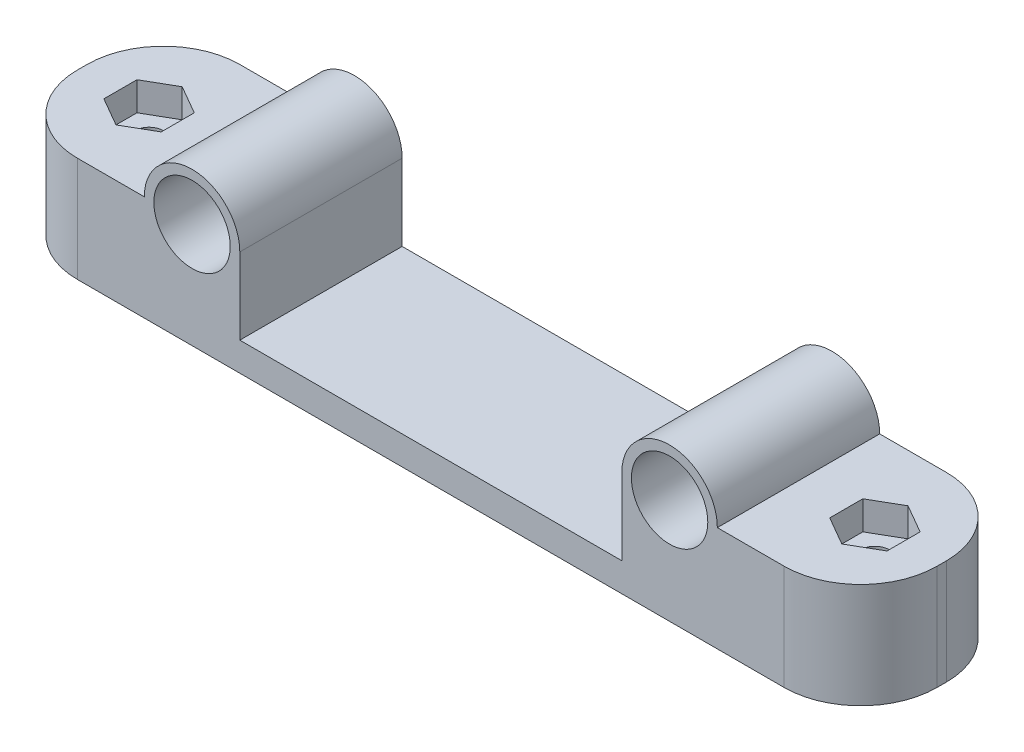
ISO-10303-21;
HEADER;
FILE_DESCRIPTION(('STEP AP214'),'2;1');
FILE_NAME('part.step','',(''),(''),'','','');
FILE_SCHEMA(('AUTOMOTIVE_DESIGN { 1 0 10303 214 1 1 1 1 }'));
ENDSEC;
DATA;
#1=APPLICATION_CONTEXT('core data for automotive mechanical design processes');
#2=APPLICATION_PROTOCOL_DEFINITION('international standard','automotive_design',2000,#1);
#3=PRODUCT_CONTEXT('',#1,'mechanical');
#4=PRODUCT('Part','Part','',(#3));
#5=PRODUCT_RELATED_PRODUCT_CATEGORY('part','',(#4));
#6=PRODUCT_DEFINITION_FORMATION('','',#4);
#7=PRODUCT_DEFINITION_CONTEXT('part definition',#1,'design');
#8=PRODUCT_DEFINITION('design','',#6,#7);
#9=PRODUCT_DEFINITION_SHAPE('','',#8);
#10=(LENGTH_UNIT() NAMED_UNIT(*) SI_UNIT(.MILLI.,.METRE.));
#11=(NAMED_UNIT(*) PLANE_ANGLE_UNIT() SI_UNIT($,.RADIAN.));
#12=(NAMED_UNIT(*) SI_UNIT($,.STERADIAN.) SOLID_ANGLE_UNIT());
#13=UNCERTAINTY_MEASURE_WITH_UNIT(LENGTH_MEASURE(1.E-05),#10,'distance_accuracy_value','');
#14=(GEOMETRIC_REPRESENTATION_CONTEXT(3) GLOBAL_UNCERTAINTY_ASSIGNED_CONTEXT((#13)) GLOBAL_UNIT_ASSIGNED_CONTEXT((#10,
#11,#12)) REPRESENTATION_CONTEXT('',''));
#15=CARTESIAN_POINT('',(0.,0.,0.));
#16=DIRECTION('',(0.,0.,1.));
#17=DIRECTION('',(1.,0.,0.));
#18=AXIS2_PLACEMENT_3D('',#15,#16,#17);
#19=CARTESIAN_POINT('',(-30.,11.,15.));
#20=DIRECTION('',(0.,-1.,0.));
#21=DIRECTION('',(1.,0.,0.));
#22=AXIS2_PLACEMENT_3D('',#19,#20,#21);
#23=PLANE('',#22);
#24=DIRECTION('',(0.,0.,-1.));
#25=VECTOR('',#24,1.);
#26=CARTESIAN_POINT('',(-45.,11.,15.));
#27=LINE('',#26,#25);
#28=CARTESIAN_POINT('',(-45.,11.,7.));
#29=VERTEX_POINT('',#28);
#30=CARTESIAN_POINT('',(-45.,11.,6.));
#31=VERTEX_POINT('',#30);
#32=EDGE_CURVE('E374',#29,#31,#27,.T.);
#33=ORIENTED_EDGE('',*,*,#32,.F.);
#34=CARTESIAN_POINT('',(-37.,11.,7.));
#35=DIRECTION('',(0.,-1.,0.));
#36=DIRECTION('',(1.,0.,0.));
#37=AXIS2_PLACEMENT_3D('',#34,#35,#36);
#38=CIRCLE('',#37,8.);
#39=CARTESIAN_POINT('',(-37.,11.,15.));
#40=VERTEX_POINT('',#39);
#41=EDGE_CURVE('E413',#29,#40,#38,.F.);
#42=ORIENTED_EDGE('',*,*,#41,.T.);
#43=DIRECTION('',(-1.,0.,0.));
#44=VECTOR('',#43,1.);
#45=CARTESIAN_POINT('',(-30.,11.,15.));
#46=LINE('',#45,#44);
#47=CARTESIAN_POINT('',(-30.,11.,15.));
#48=VERTEX_POINT('',#47);
#49=EDGE_CURVE('E362',#48,#40,#46,.T.);
#50=ORIENTED_EDGE('',*,*,#49,.F.);
#51=DIRECTION('',(0.,0.,-1.));
#52=VECTOR('',#51,1.);
#53=CARTESIAN_POINT('',(-30.,11.,15.));
#54=LINE('',#53,#52);
#55=CARTESIAN_POINT('',(-30.,11.,-2.));
#56=VERTEX_POINT('',#55);
#57=EDGE_CURVE('E377',#48,#56,#54,.T.);
#58=ORIENTED_EDGE('',*,*,#57,.T.);
#59=DIRECTION('',(1.,0.,0.));
#60=VECTOR('',#59,1.);
#61=CARTESIAN_POINT('',(-45.,11.,-2.));
#62=LINE('',#61,#60);
#63=CARTESIAN_POINT('',(-37.,11.,-2.));
#64=VERTEX_POINT('',#63);
#65=EDGE_CURVE('E321',#64,#56,#62,.T.);
#66=ORIENTED_EDGE('',*,*,#65,.F.);
#67=CARTESIAN_POINT('',(-37.,11.,6.));
#68=DIRECTION('',(0.,-1.,0.));
#69=DIRECTION('',(1.,0.,0.));
#70=AXIS2_PLACEMENT_3D('',#67,#68,#69);
#71=CIRCLE('',#70,8.);
#72=EDGE_CURVE('E411',#64,#31,#71,.F.);
#73=ORIENTED_EDGE('',*,*,#72,.T.);
#74=EDGE_LOOP('',(#33,#42,#50,#58,#66,#73));
#75=FACE_BOUND('',#74,.T.);
#76=DIRECTION('',(0.866025403784439,0.,-0.5));
#77=VECTOR('',#76,1.);
#78=CARTESIAN_POINT('',(-41.,11.,4.76794919243112));
#79=LINE('',#78,#77);
#80=CARTESIAN_POINT('',(-41.,11.,4.76794919243112));
#81=VERTEX_POINT('',#80);
#82=CARTESIAN_POINT('',(-38.,11.,3.03589838486224));
#83=VERTEX_POINT('',#82);
#84=EDGE_CURVE('E52',#81,#83,#79,.T.);
#85=ORIENTED_EDGE('',*,*,#84,.T.);
#86=DIRECTION('',(0.866025403784439,0.,0.5));
#87=VECTOR('',#86,1.);
#88=CARTESIAN_POINT('',(-38.,11.,3.03589838486224));
#89=LINE('',#88,#87);
#90=CARTESIAN_POINT('',(-35.,11.,4.76794919243112));
#91=VERTEX_POINT('',#90);
#92=EDGE_CURVE('E230',#83,#91,#89,.T.);
#93=ORIENTED_EDGE('',*,*,#92,.T.);
#94=DIRECTION('',(0.,0.,1.));
#95=VECTOR('',#94,1.);
#96=CARTESIAN_POINT('',(-35.,11.,4.76794919243112));
#97=LINE('',#96,#95);
#98=CARTESIAN_POINT('',(-35.,11.,8.23205080756887));
#99=VERTEX_POINT('',#98);
#100=EDGE_CURVE('E233',#91,#99,#97,.T.);
#101=ORIENTED_EDGE('',*,*,#100,.T.);
#102=DIRECTION('',(-0.866025403784438,0.,0.5));
#103=VECTOR('',#102,1.);
#104=CARTESIAN_POINT('',(-35.,11.,8.23205080756887));
#105=LINE('',#104,#103);
#106=CARTESIAN_POINT('',(-38.,11.,9.96410161513775));
#107=VERTEX_POINT('',#106);
#108=EDGE_CURVE('E248',#99,#107,#105,.T.);
#109=ORIENTED_EDGE('',*,*,#108,.T.);
#110=DIRECTION('',(-0.866025403784439,0.,-0.499999999999999));
#111=VECTOR('',#110,1.);
#112=CARTESIAN_POINT('',(-38.,11.,9.96410161513775));
#113=LINE('',#112,#111);
#114=CARTESIAN_POINT('',(-41.,11.,8.23205080756888));
#115=VERTEX_POINT('',#114);
#116=EDGE_CURVE('E245',#107,#115,#113,.T.);
#117=ORIENTED_EDGE('',*,*,#116,.T.);
#118=DIRECTION('',(0.,0.,-1.));
#119=VECTOR('',#118,1.);
#120=CARTESIAN_POINT('',(-41.,11.,8.23205080756888));
#121=LINE('',#120,#119);
#122=EDGE_CURVE('E243',#115,#81,#121,.T.);
#123=ORIENTED_EDGE('',*,*,#122,.T.);
#124=EDGE_LOOP('',(#85,#93,#101,#109,#117,#123));
#125=FACE_BOUND('',#124,.T.);
#126=ADVANCED_FACE('F35',(#75,#125),#23,.F.);
#127=CARTESIAN_POINT('',(-38.,0.,6.5));
#128=DIRECTION('',(0.,1.,0.));
#129=DIRECTION('',(0.,0.,1.));
#130=AXIS2_PLACEMENT_3D('',#127,#128,#129);
#131=CYLINDRICAL_SURFACE('',#130,1.5);
#132=CARTESIAN_POINT('',(-38.,0.,6.5));
#133=DIRECTION('',(0.,-1.,0.));
#134=DIRECTION('',(0.,0.,1.));
#135=AXIS2_PLACEMENT_3D('',#132,#133,#134);
#136=CIRCLE('',#135,1.5);
#137=CARTESIAN_POINT('',(-38.,0.,8.));
#138=VERTEX_POINT('',#137);
#139=EDGE_CURVE('E309',#138,#138,#136,.T.);
#140=ORIENTED_EDGE('',*,*,#139,.T.);
#141=EDGE_LOOP('',(#140));
#142=FACE_BOUND('',#141,.T.);
#143=CARTESIAN_POINT('',(-38.,8.,6.5));
#144=DIRECTION('',(0.,1.,0.));
#145=DIRECTION('',(0.,0.,1.));
#146=AXIS2_PLACEMENT_3D('',#143,#144,#145);
#147=CIRCLE('',#146,1.5);
#148=CARTESIAN_POINT('',(-38.,8.,8.));
#149=VERTEX_POINT('',#148);
#150=EDGE_CURVE('E39',#149,#149,#147,.T.);
#151=ORIENTED_EDGE('',*,*,#150,.T.);
#152=EDGE_LOOP('',(#151));
#153=FACE_BOUND('',#152,.T.);
#154=ADVANCED_FACE('F433',(#142,#153),#131,.F.);
#155=CARTESIAN_POINT('',(38.,0.,6.5));
#156=DIRECTION('',(0.,1.,0.));
#157=DIRECTION('',(0.,0.,1.));
#158=AXIS2_PLACEMENT_3D('',#155,#156,#157);
#159=CYLINDRICAL_SURFACE('',#158,1.5);
#160=CARTESIAN_POINT('',(38.,0.,6.5));
#161=DIRECTION('',(0.,1.,0.));
#162=DIRECTION('',(0.,0.,1.));
#163=AXIS2_PLACEMENT_3D('',#160,#161,#162);
#164=CIRCLE('',#163,1.5);
#165=CARTESIAN_POINT('',(38.,0.,8.));
#166=VERTEX_POINT('',#165);
#167=EDGE_CURVE('E312',#166,#166,#164,.T.);
#168=ORIENTED_EDGE('',*,*,#167,.F.);
#169=EDGE_LOOP('',(#168));
#170=FACE_BOUND('',#169,.T.);
#171=CARTESIAN_POINT('',(38.,8.,6.5));
#172=DIRECTION('',(0.,1.,0.));
#173=DIRECTION('',(0.,0.,1.));
#174=AXIS2_PLACEMENT_3D('',#171,#172,#173);
#175=CIRCLE('',#174,1.5);
#176=CARTESIAN_POINT('',(38.,8.,8.));
#177=VERTEX_POINT('',#176);
#178=EDGE_CURVE('E299',#177,#177,#175,.F.);
#179=ORIENTED_EDGE('',*,*,#178,.F.);
#180=EDGE_LOOP('',(#179));
#181=FACE_BOUND('',#180,.T.);
#182=ADVANCED_FACE('F430',(#170,#181),#159,.F.);
#183=CARTESIAN_POINT('',(-25.,11.,15.));
#184=DIRECTION('',(0.,0.,-1.));
#185=DIRECTION('',(-1.,0.,0.));
#186=AXIS2_PLACEMENT_3D('',#183,#184,#185);
#187=PLANE('',#186);
#188=ORIENTED_EDGE('',*,*,#49,.T.);
#189=DIRECTION('',(0.,-1.,0.));
#190=VECTOR('',#189,1.);
#191=CARTESIAN_POINT('',(-37.,11.,15.));
#192=LINE('',#191,#190);
#193=CARTESIAN_POINT('',(-37.,0.,15.));
#194=VERTEX_POINT('',#193);
#195=EDGE_CURVE('E396',#40,#194,#192,.T.);
#196=ORIENTED_EDGE('',*,*,#195,.T.);
#197=DIRECTION('',(1.,0.,0.));
#198=VECTOR('',#197,1.);
#199=CARTESIAN_POINT('',(-45.,0.,15.));
#200=LINE('',#199,#198);
#201=CARTESIAN_POINT('',(37.,0.,15.));
#202=VERTEX_POINT('',#201);
#203=EDGE_CURVE('E365',#194,#202,#200,.T.);
#204=ORIENTED_EDGE('',*,*,#203,.T.);
#205=DIRECTION('',(0.,1.,0.));
#206=VECTOR('',#205,1.);
#207=CARTESIAN_POINT('',(37.,11.,15.));
#208=LINE('',#207,#206);
#209=CARTESIAN_POINT('',(37.,11.,15.));
#210=VERTEX_POINT('',#209);
#211=EDGE_CURVE('E393',#202,#210,#208,.T.);
#212=ORIENTED_EDGE('',*,*,#211,.T.);
#213=DIRECTION('',(-1.,0.,0.));
#214=VECTOR('',#213,1.);
#215=CARTESIAN_POINT('',(30.,11.,15.));
#216=LINE('',#215,#214);
#217=CARTESIAN_POINT('',(30.,11.,15.));
#218=VERTEX_POINT('',#217);
#219=EDGE_CURVE('E348',#210,#218,#216,.T.);
#220=ORIENTED_EDGE('',*,*,#219,.T.);
#221=CARTESIAN_POINT('',(25.,11.,15.));
#222=DIRECTION('',(0.,0.,1.));
#223=DIRECTION('',(1.,0.,0.));
#224=AXIS2_PLACEMENT_3D('',#221,#222,#223);
#225=CIRCLE('',#224,5.);
#226=CARTESIAN_POINT('',(20.,11.,15.));
#227=VERTEX_POINT('',#226);
#228=EDGE_CURVE('E352',#218,#227,#225,.T.);
#229=ORIENTED_EDGE('',*,*,#228,.T.);
#230=DIRECTION('',(0.,-1.,0.));
#231=VECTOR('',#230,1.);
#232=CARTESIAN_POINT('',(20.,3.00000000000001,15.));
#233=LINE('',#232,#231);
#234=CARTESIAN_POINT('',(20.,3.00000000000001,15.));
#235=VERTEX_POINT('',#234);
#236=EDGE_CURVE('E354',#227,#235,#233,.T.);
#237=ORIENTED_EDGE('',*,*,#236,.T.);
#238=DIRECTION('',(-1.,0.,0.));
#239=VECTOR('',#238,1.);
#240=CARTESIAN_POINT('',(-20.,3.,15.));
#241=LINE('',#240,#239);
#242=CARTESIAN_POINT('',(-20.,3.,15.));
#243=VERTEX_POINT('',#242);
#244=EDGE_CURVE('E356',#235,#243,#241,.T.);
#245=ORIENTED_EDGE('',*,*,#244,.T.);
#246=DIRECTION('',(0.,1.,0.));
#247=VECTOR('',#246,1.);
#248=CARTESIAN_POINT('',(-20.,11.,15.));
#249=LINE('',#248,#247);
#250=CARTESIAN_POINT('',(-20.,11.,15.));
#251=VERTEX_POINT('',#250);
#252=EDGE_CURVE('E358',#243,#251,#249,.T.);
#253=ORIENTED_EDGE('',*,*,#252,.T.);
#254=CARTESIAN_POINT('',(-25.,11.,15.));
#255=DIRECTION('',(0.,0.,1.));
#256=DIRECTION('',(-1.,0.,0.));
#257=AXIS2_PLACEMENT_3D('',#254,#255,#256);
#258=CIRCLE('',#257,5.);
#259=EDGE_CURVE('E360',#251,#48,#258,.T.);
#260=ORIENTED_EDGE('',*,*,#259,.T.);
#261=EDGE_LOOP('',(#188,#196,#204,#212,#220,#229,#237,#245,#253,#260));
#262=FACE_BOUND('',#261,.T.);
#263=CARTESIAN_POINT('',(-25.,11.,15.));
#264=DIRECTION('',(0.,0.,1.));
#265=DIRECTION('',(-1.,0.,0.));
#266=AXIS2_PLACEMENT_3D('',#263,#264,#265);
#267=CIRCLE('',#266,4.);
#268=CARTESIAN_POINT('',(-29.,11.,15.));
#269=VERTEX_POINT('',#268);
#270=EDGE_CURVE('E345',#269,#269,#267,.T.);
#271=ORIENTED_EDGE('',*,*,#270,.F.);
#272=EDGE_LOOP('',(#271));
#273=FACE_BOUND('',#272,.T.);
#274=CARTESIAN_POINT('',(25.,11.,15.));
#275=DIRECTION('',(0.,0.,1.));
#276=DIRECTION('',(1.,0.,0.));
#277=AXIS2_PLACEMENT_3D('',#274,#275,#276);
#278=CIRCLE('',#277,4.);
#279=CARTESIAN_POINT('',(29.,11.,15.));
#280=VERTEX_POINT('',#279);
#281=EDGE_CURVE('E339',#280,#280,#278,.T.);
#282=ORIENTED_EDGE('',*,*,#281,.F.);
#283=EDGE_LOOP('',(#282));
#284=FACE_BOUND('',#283,.T.);
#285=ADVANCED_FACE('F432',(#262,#273,#284),#187,.F.);
#286=CARTESIAN_POINT('',(45.,11.,15.));
#287=DIRECTION('',(-1.,0.,0.));
#288=DIRECTION('',(0.,-1.,0.));
#289=AXIS2_PLACEMENT_3D('',#286,#287,#288);
#290=PLANE('',#289);
#291=DIRECTION('',(0.,0.,-1.));
#292=VECTOR('',#291,1.);
#293=CARTESIAN_POINT('',(45.,0.,15.));
#294=LINE('',#293,#292);
#295=CARTESIAN_POINT('',(45.,0.,7.));
#296=VERTEX_POINT('',#295);
#297=CARTESIAN_POINT('',(45.,0.,6.));
#298=VERTEX_POINT('',#297);
#299=EDGE_CURVE('E368',#296,#298,#294,.T.);
#300=ORIENTED_EDGE('',*,*,#299,.T.);
#301=DIRECTION('',(0.,-1.,0.));
#302=VECTOR('',#301,1.);
#303=CARTESIAN_POINT('',(45.,11.,6.));
#304=LINE('',#303,#302);
#305=CARTESIAN_POINT('',(45.,11.,6.));
#306=VERTEX_POINT('',#305);
#307=EDGE_CURVE('E423',#298,#306,#304,.F.);
#308=ORIENTED_EDGE('',*,*,#307,.T.);
#309=DIRECTION('',(0.,0.,-1.));
#310=VECTOR('',#309,1.);
#311=CARTESIAN_POINT('',(45.,11.,15.));
#312=LINE('',#311,#310);
#313=CARTESIAN_POINT('',(45.,11.,7.));
#314=VERTEX_POINT('',#313);
#315=EDGE_CURVE('E390',#314,#306,#312,.T.);
#316=ORIENTED_EDGE('',*,*,#315,.F.);
#317=DIRECTION('',(0.,1.,0.));
#318=VECTOR('',#317,1.);
#319=CARTESIAN_POINT('',(45.,11.,7.));
#320=LINE('',#319,#318);
#321=EDGE_CURVE('E421',#314,#296,#320,.F.);
#322=ORIENTED_EDGE('',*,*,#321,.T.);
#323=EDGE_LOOP('',(#300,#308,#316,#322));
#324=FACE_BOUND('',#323,.T.);
#325=ADVANCED_FACE('F440',(#324),#290,.F.);
#326=CARTESIAN_POINT('',(30.,11.,15.));
#327=DIRECTION('',(0.,-1.,0.));
#328=DIRECTION('',(0.,0.,-1.));
#329=AXIS2_PLACEMENT_3D('',#326,#327,#328);
#330=PLANE('',#329);
#331=DIRECTION('',(-0.866025403784439,0.,0.5));
#332=VECTOR('',#331,1.);
#333=CARTESIAN_POINT('',(38.,11.,3.03589838486224));
#334=LINE('',#333,#332);
#335=CARTESIAN_POINT('',(38.,11.,3.03589838486224));
#336=VERTEX_POINT('',#335);
#337=CARTESIAN_POINT('',(35.,11.,4.76794919243112));
#338=VERTEX_POINT('',#337);
#339=EDGE_CURVE('E283',#336,#338,#334,.T.);
#340=ORIENTED_EDGE('',*,*,#339,.F.);
#341=DIRECTION('',(-0.866025403784439,0.,-0.5));
#342=VECTOR('',#341,1.);
#343=CARTESIAN_POINT('',(41.,11.,4.76794919243112));
#344=LINE('',#343,#342);
#345=CARTESIAN_POINT('',(41.,11.,4.76794919243112));
#346=VERTEX_POINT('',#345);
#347=EDGE_CURVE('E60',#346,#336,#344,.T.);
#348=ORIENTED_EDGE('',*,*,#347,.F.);
#349=DIRECTION('',(0.,0.,-1.));
#350=VECTOR('',#349,1.);
#351=CARTESIAN_POINT('',(41.,11.,8.23205080756888));
#352=LINE('',#351,#350);
#353=CARTESIAN_POINT('',(41.,11.,8.23205080756888));
#354=VERTEX_POINT('',#353);
#355=EDGE_CURVE('E266',#354,#346,#352,.T.);
#356=ORIENTED_EDGE('',*,*,#355,.F.);
#357=DIRECTION('',(0.866025403784439,0.,-0.499999999999999));
#358=VECTOR('',#357,1.);
#359=CARTESIAN_POINT('',(38.,11.,9.96410161513775));
#360=LINE('',#359,#358);
#361=CARTESIAN_POINT('',(38.,11.,9.96410161513775));
#362=VERTEX_POINT('',#361);
#363=EDGE_CURVE('E292',#362,#354,#360,.T.);
#364=ORIENTED_EDGE('',*,*,#363,.F.);
#365=DIRECTION('',(0.866025403784438,0.,0.5));
#366=VECTOR('',#365,1.);
#367=CARTESIAN_POINT('',(35.,11.,8.23205080756887));
#368=LINE('',#367,#366);
#369=CARTESIAN_POINT('',(35.,11.,8.23205080756887));
#370=VERTEX_POINT('',#369);
#371=EDGE_CURVE('E289',#370,#362,#368,.T.);
#372=ORIENTED_EDGE('',*,*,#371,.F.);
#373=DIRECTION('',(0.,0.,1.));
#374=VECTOR('',#373,1.);
#375=CARTESIAN_POINT('',(35.,11.,4.76794919243112));
#376=LINE('',#375,#374);
#377=EDGE_CURVE('E286',#338,#370,#376,.T.);
#378=ORIENTED_EDGE('',*,*,#377,.F.);
#379=EDGE_LOOP('',(#340,#348,#356,#364,#372,#378));
#380=FACE_BOUND('',#379,.T.);
#381=ORIENTED_EDGE('',*,*,#315,.T.);
#382=CARTESIAN_POINT('',(37.,11.,6.));
#383=DIRECTION('',(0.,-1.,0.));
#384=DIRECTION('',(0.,0.,-1.));
#385=AXIS2_PLACEMENT_3D('',#382,#383,#384);
#386=CIRCLE('',#385,8.);
#387=CARTESIAN_POINT('',(37.,11.,-2.));
#388=VERTEX_POINT('',#387);
#389=EDGE_CURVE('E11',#306,#388,#386,.F.);
#390=ORIENTED_EDGE('',*,*,#389,.T.);
#391=DIRECTION('',(1.,0.,0.));
#392=VECTOR('',#391,1.);
#393=CARTESIAN_POINT('',(30.,11.,-2.));
#394=LINE('',#393,#392);
#395=CARTESIAN_POINT('',(30.,11.,-2.));
#396=VERTEX_POINT('',#395);
#397=EDGE_CURVE('E315',#396,#388,#394,.T.);
#398=ORIENTED_EDGE('',*,*,#397,.F.);
#399=DIRECTION('',(0.,0.,-1.));
#400=VECTOR('',#399,1.);
#401=CARTESIAN_POINT('',(30.,11.,15.));
#402=LINE('',#401,#400);
#403=EDGE_CURVE('E388',#218,#396,#402,.T.);
#404=ORIENTED_EDGE('',*,*,#403,.F.);
#405=ORIENTED_EDGE('',*,*,#219,.F.);
#406=CARTESIAN_POINT('',(37.,11.,7.));
#407=DIRECTION('',(0.,-1.,0.));
#408=DIRECTION('',(0.,0.,-1.));
#409=AXIS2_PLACEMENT_3D('',#406,#407,#408);
#410=CIRCLE('',#409,8.);
#411=EDGE_CURVE('E44',#210,#314,#410,.F.);
#412=ORIENTED_EDGE('',*,*,#411,.T.);
#413=EDGE_LOOP('',(#381,#390,#398,#404,#405,#412));
#414=FACE_BOUND('',#413,.T.);
#415=ADVANCED_FACE('F477',(#380,#414),#330,.F.);
#416=CARTESIAN_POINT('',(25.,11.,15.));
#417=DIRECTION('',(0.,0.,-1.));
#418=DIRECTION('',(-1.,0.,0.));
#419=AXIS2_PLACEMENT_3D('',#416,#417,#418);
#420=CYLINDRICAL_SURFACE('',#419,5.);
#421=ORIENTED_EDGE('',*,*,#403,.T.);
#422=CARTESIAN_POINT('',(25.,11.,-2.));
#423=DIRECTION('',(0.,0.,-1.));
#424=DIRECTION('',(-1.,0.,0.));
#425=AXIS2_PLACEMENT_3D('',#422,#423,#424);
#426=CIRCLE('',#425,5.);
#427=CARTESIAN_POINT('',(20.,11.,-2.));
#428=VERTEX_POINT('',#427);
#429=EDGE_CURVE('E335',#428,#396,#426,.T.);
#430=ORIENTED_EDGE('',*,*,#429,.F.);
#431=DIRECTION('',(0.,0.,-1.));
#432=VECTOR('',#431,1.);
#433=CARTESIAN_POINT('',(20.,11.,15.));
#434=LINE('',#433,#432);
#435=EDGE_CURVE('E386',#227,#428,#434,.T.);
#436=ORIENTED_EDGE('',*,*,#435,.F.);
#437=ORIENTED_EDGE('',*,*,#228,.F.);
#438=EDGE_LOOP('',(#421,#430,#436,#437));
#439=FACE_BOUND('',#438,.T.);
#440=ADVANCED_FACE('F473',(#439),#420,.T.);
#441=CARTESIAN_POINT('',(20.,3.00000000000001,15.));
#442=DIRECTION('',(1.,0.,0.));
#443=DIRECTION('',(0.,0.,-1.));
#444=AXIS2_PLACEMENT_3D('',#441,#442,#443);
#445=PLANE('',#444);
#446=ORIENTED_EDGE('',*,*,#435,.T.);
#447=DIRECTION('',(0.,1.,0.));
#448=VECTOR('',#447,1.);
#449=CARTESIAN_POINT('',(20.,3.00000000000001,-2.));
#450=LINE('',#449,#448);
#451=CARTESIAN_POINT('',(20.,3.00000000000001,-2.));
#452=VERTEX_POINT('',#451);
#453=EDGE_CURVE('E332',#452,#428,#450,.T.);
#454=ORIENTED_EDGE('',*,*,#453,.F.);
#455=DIRECTION('',(0.,0.,-1.));
#456=VECTOR('',#455,1.);
#457=CARTESIAN_POINT('',(20.,3.00000000000001,15.));
#458=LINE('',#457,#456);
#459=EDGE_CURVE('E384',#235,#452,#458,.T.);
#460=ORIENTED_EDGE('',*,*,#459,.F.);
#461=ORIENTED_EDGE('',*,*,#236,.F.);
#462=EDGE_LOOP('',(#446,#454,#460,#461));
#463=FACE_BOUND('',#462,.T.);
#464=ADVANCED_FACE('F469',(#463),#445,.F.);
#465=CARTESIAN_POINT('',(-20.,3.,15.));
#466=DIRECTION('',(0.,-1.,0.));
#467=DIRECTION('',(1.,0.,0.));
#468=AXIS2_PLACEMENT_3D('',#465,#466,#467);
#469=PLANE('',#468);
#470=ORIENTED_EDGE('',*,*,#459,.T.);
#471=DIRECTION('',(1.,0.,0.));
#472=VECTOR('',#471,1.);
#473=CARTESIAN_POINT('',(-20.,3.,-2.));
#474=LINE('',#473,#472);
#475=CARTESIAN_POINT('',(-20.,3.,-2.));
#476=VERTEX_POINT('',#475);
#477=EDGE_CURVE('E329',#476,#452,#474,.T.);
#478=ORIENTED_EDGE('',*,*,#477,.F.);
#479=DIRECTION('',(0.,0.,-1.));
#480=VECTOR('',#479,1.);
#481=CARTESIAN_POINT('',(-20.,3.,15.));
#482=LINE('',#481,#480);
#483=EDGE_CURVE('E382',#243,#476,#482,.T.);
#484=ORIENTED_EDGE('',*,*,#483,.F.);
#485=ORIENTED_EDGE('',*,*,#244,.F.);
#486=EDGE_LOOP('',(#470,#478,#484,#485));
#487=FACE_BOUND('',#486,.T.);
#488=ADVANCED_FACE('F465',(#487),#469,.F.);
#489=CARTESIAN_POINT('',(-20.,11.,15.));
#490=DIRECTION('',(-1.,0.,0.));
#491=DIRECTION('',(0.,0.,1.));
#492=AXIS2_PLACEMENT_3D('',#489,#490,#491);
#493=PLANE('',#492);
#494=ORIENTED_EDGE('',*,*,#483,.T.);
#495=DIRECTION('',(0.,-1.,0.));
#496=VECTOR('',#495,1.);
#497=CARTESIAN_POINT('',(-20.,11.,-2.));
#498=LINE('',#497,#496);
#499=CARTESIAN_POINT('',(-20.,11.,-2.));
#500=VERTEX_POINT('',#499);
#501=EDGE_CURVE('E326',#500,#476,#498,.T.);
#502=ORIENTED_EDGE('',*,*,#501,.F.);
#503=DIRECTION('',(0.,0.,-1.));
#504=VECTOR('',#503,1.);
#505=CARTESIAN_POINT('',(-20.,11.,15.));
#506=LINE('',#505,#504);
#507=EDGE_CURVE('E380',#251,#500,#506,.T.);
#508=ORIENTED_EDGE('',*,*,#507,.F.);
#509=ORIENTED_EDGE('',*,*,#252,.F.);
#510=EDGE_LOOP('',(#494,#502,#508,#509));
#511=FACE_BOUND('',#510,.T.);
#512=ADVANCED_FACE('F461',(#511),#493,.F.);
#513=CARTESIAN_POINT('',(-25.,11.,15.));
#514=DIRECTION('',(0.,0.,-1.));
#515=DIRECTION('',(-1.,0.,0.));
#516=AXIS2_PLACEMENT_3D('',#513,#514,#515);
#517=CYLINDRICAL_SURFACE('',#516,5.);
#518=ORIENTED_EDGE('',*,*,#507,.T.);
#519=CARTESIAN_POINT('',(-25.,11.,-2.));
#520=DIRECTION('',(0.,0.,-1.));
#521=DIRECTION('',(-1.,0.,0.));
#522=AXIS2_PLACEMENT_3D('',#519,#520,#521);
#523=CIRCLE('',#522,5.);
#524=EDGE_CURVE('E323',#56,#500,#523,.T.);
#525=ORIENTED_EDGE('',*,*,#524,.F.);
#526=ORIENTED_EDGE('',*,*,#57,.F.);
#527=ORIENTED_EDGE('',*,*,#259,.F.);
#528=EDGE_LOOP('',(#518,#525,#526,#527));
#529=FACE_BOUND('',#528,.T.);
#530=ADVANCED_FACE('F458',(#529),#517,.T.);
#531=CARTESIAN_POINT('',(-45.,11.,15.));
#532=DIRECTION('',(1.,0.,0.));
#533=DIRECTION('',(0.,1.,0.));
#534=AXIS2_PLACEMENT_3D('',#531,#532,#533);
#535=PLANE('',#534);
#536=DIRECTION('',(0.,0.,-1.));
#537=VECTOR('',#536,1.);
#538=CARTESIAN_POINT('',(-45.,0.,15.));
#539=LINE('',#538,#537);
#540=CARTESIAN_POINT('',(-45.,0.,7.));
#541=VERTEX_POINT('',#540);
#542=CARTESIAN_POINT('',(-45.,0.,6.));
#543=VERTEX_POINT('',#542);
#544=EDGE_CURVE('E371',#541,#543,#539,.T.);
#545=ORIENTED_EDGE('',*,*,#544,.F.);
#546=DIRECTION('',(0.,-1.,0.));
#547=VECTOR('',#546,1.);
#548=CARTESIAN_POINT('',(-45.,11.,7.));
#549=LINE('',#548,#547);
#550=EDGE_CURVE('E409',#541,#29,#549,.F.);
#551=ORIENTED_EDGE('',*,*,#550,.T.);
#552=ORIENTED_EDGE('',*,*,#32,.T.);
#553=DIRECTION('',(0.,1.,0.));
#554=VECTOR('',#553,1.);
#555=CARTESIAN_POINT('',(-45.,0.,6.));
#556=LINE('',#555,#554);
#557=EDGE_CURVE('E407',#31,#543,#556,.F.);
#558=ORIENTED_EDGE('',*,*,#557,.T.);
#559=EDGE_LOOP('',(#545,#551,#552,#558));
#560=FACE_BOUND('',#559,.T.);
#561=ADVANCED_FACE('F456',(#560),#535,.F.);
#562=CARTESIAN_POINT('',(-45.,0.,15.));
#563=DIRECTION('',(0.,1.,0.));
#564=DIRECTION('',(-1.,0.,0.));
#565=AXIS2_PLACEMENT_3D('',#562,#563,#564);
#566=PLANE('',#565);
#567=ORIENTED_EDGE('',*,*,#139,.F.);
#568=EDGE_LOOP('',(#567));
#569=FACE_BOUND('',#568,.T.);
#570=ORIENTED_EDGE('',*,*,#167,.T.);
#571=EDGE_LOOP('',(#570));
#572=FACE_BOUND('',#571,.T.);
#573=ORIENTED_EDGE('',*,*,#203,.F.);
#574=CARTESIAN_POINT('',(-37.,0.,7.));
#575=DIRECTION('',(0.,1.,0.));
#576=DIRECTION('',(-1.,0.,0.));
#577=AXIS2_PLACEMENT_3D('',#574,#575,#576);
#578=CIRCLE('',#577,8.);
#579=EDGE_CURVE('E405',#194,#541,#578,.F.);
#580=ORIENTED_EDGE('',*,*,#579,.T.);
#581=ORIENTED_EDGE('',*,*,#544,.T.);
#582=CARTESIAN_POINT('',(-37.,0.,6.));
#583=DIRECTION('',(0.,1.,0.));
#584=DIRECTION('',(-1.,0.,0.));
#585=AXIS2_PLACEMENT_3D('',#582,#583,#584);
#586=CIRCLE('',#585,8.);
#587=CARTESIAN_POINT('',(-37.,0.,-2.));
#588=VERTEX_POINT('',#587);
#589=EDGE_CURVE('E403',#543,#588,#586,.F.);
#590=ORIENTED_EDGE('',*,*,#589,.T.);
#591=DIRECTION('',(-1.,0.,0.));
#592=VECTOR('',#591,1.);
#593=CARTESIAN_POINT('',(45.,0.,-2.));
#594=LINE('',#593,#592);
#595=CARTESIAN_POINT('',(37.,0.,-2.));
#596=VERTEX_POINT('',#595);
#597=EDGE_CURVE('E318',#596,#588,#594,.T.);
#598=ORIENTED_EDGE('',*,*,#597,.F.);
#599=CARTESIAN_POINT('',(37.,0.,6.));
#600=DIRECTION('',(0.,1.,0.));
#601=DIRECTION('',(-1.,0.,0.));
#602=AXIS2_PLACEMENT_3D('',#599,#600,#601);
#603=CIRCLE('',#602,8.);
#604=EDGE_CURVE('E401',#596,#298,#603,.F.);
#605=ORIENTED_EDGE('',*,*,#604,.T.);
#606=ORIENTED_EDGE('',*,*,#299,.F.);
#607=CARTESIAN_POINT('',(37.,0.,7.));
#608=DIRECTION('',(0.,1.,0.));
#609=DIRECTION('',(-1.,0.,0.));
#610=AXIS2_PLACEMENT_3D('',#607,#608,#609);
#611=CIRCLE('',#610,8.);
#612=EDGE_CURVE('E399',#296,#202,#611,.F.);
#613=ORIENTED_EDGE('',*,*,#612,.T.);
#614=EDGE_LOOP('',(#573,#580,#581,#590,#598,#605,#606,#613));
#615=FACE_BOUND('',#614,.T.);
#616=ADVANCED_FACE('F522',(#569,#572,#615),#566,.F.);
#617=CARTESIAN_POINT('',(-25.,11.,15.));
#618=DIRECTION('',(0.,0.,-1.));
#619=DIRECTION('',(-1.,0.,0.));
#620=AXIS2_PLACEMENT_3D('',#617,#618,#619);
#621=CYLINDRICAL_SURFACE('',#620,4.);
#622=ORIENTED_EDGE('',*,*,#270,.T.);
#623=EDGE_LOOP('',(#622));
#624=FACE_BOUND('',#623,.T.);
#625=CARTESIAN_POINT('',(-25.,11.,0.));
#626=DIRECTION('',(0.,0.,1.));
#627=DIRECTION('',(-1.,0.,0.));
#628=AXIS2_PLACEMENT_3D('',#625,#626,#627);
#629=CIRCLE('',#628,4.);
#630=CARTESIAN_POINT('',(-29.,11.,0.));
#631=VERTEX_POINT('',#630);
#632=EDGE_CURVE('E342',#631,#631,#629,.T.);
#633=ORIENTED_EDGE('',*,*,#632,.F.);
#634=EDGE_LOOP('',(#633));
#635=FACE_BOUND('',#634,.T.);
#636=ADVANCED_FACE('F547',(#624,#635),#621,.F.);
#637=CARTESIAN_POINT('',(25.,11.,15.));
#638=DIRECTION('',(0.,0.,-1.));
#639=DIRECTION('',(-1.,0.,0.));
#640=AXIS2_PLACEMENT_3D('',#637,#638,#639);
#641=CYLINDRICAL_SURFACE('',#640,4.);
#642=ORIENTED_EDGE('',*,*,#281,.T.);
#643=EDGE_LOOP('',(#642));
#644=FACE_BOUND('',#643,.T.);
#645=CARTESIAN_POINT('',(25.,11.,0.));
#646=DIRECTION('',(0.,0.,1.));
#647=DIRECTION('',(1.,0.,0.));
#648=AXIS2_PLACEMENT_3D('',#645,#646,#647);
#649=CIRCLE('',#648,4.);
#650=CARTESIAN_POINT('',(29.,11.,0.));
#651=VERTEX_POINT('',#650);
#652=EDGE_CURVE('E338',#651,#651,#649,.T.);
#653=ORIENTED_EDGE('',*,*,#652,.F.);
#654=EDGE_LOOP('',(#653));
#655=FACE_BOUND('',#654,.T.);
#656=ADVANCED_FACE('F552',(#644,#655),#641,.F.);
#657=CARTESIAN_POINT('',(-25.,11.,0.));
#658=DIRECTION('',(0.,0.,-1.));
#659=DIRECTION('',(-1.,0.,0.));
#660=AXIS2_PLACEMENT_3D('',#657,#658,#659);
#661=PLANE('',#660);
#662=ORIENTED_EDGE('',*,*,#652,.T.);
#663=EDGE_LOOP('',(#662));
#664=FACE_BOUND('',#663,.T.);
#665=ADVANCED_FACE('F560',(#664),#661,.F.);
#666=ORIENTED_EDGE('',*,*,#632,.T.);
#667=EDGE_LOOP('',(#666));
#668=FACE_BOUND('',#667,.T.);
#669=ADVANCED_FACE('F562',(#668),#661,.F.);
#670=CARTESIAN_POINT('',(-25.,11.,-2.));
#671=DIRECTION('',(0.,0.,-1.));
#672=DIRECTION('',(-1.,0.,0.));
#673=AXIS2_PLACEMENT_3D('',#670,#671,#672);
#674=PLANE('',#673);
#675=ORIENTED_EDGE('',*,*,#597,.T.);
#676=DIRECTION('',(0.,1.,0.));
#677=VECTOR('',#676,1.);
#678=CARTESIAN_POINT('',(-37.,11.,-2.));
#679=LINE('',#678,#677);
#680=EDGE_CURVE('E418',#588,#64,#679,.T.);
#681=ORIENTED_EDGE('',*,*,#680,.T.);
#682=ORIENTED_EDGE('',*,*,#65,.T.);
#683=ORIENTED_EDGE('',*,*,#524,.T.);
#684=ORIENTED_EDGE('',*,*,#501,.T.);
#685=ORIENTED_EDGE('',*,*,#477,.T.);
#686=ORIENTED_EDGE('',*,*,#453,.T.);
#687=ORIENTED_EDGE('',*,*,#429,.T.);
#688=ORIENTED_EDGE('',*,*,#397,.T.);
#689=DIRECTION('',(0.,-1.,0.));
#690=VECTOR('',#689,1.);
#691=CARTESIAN_POINT('',(37.,0.,-2.));
#692=LINE('',#691,#690);
#693=EDGE_CURVE('E415',#388,#596,#692,.T.);
#694=ORIENTED_EDGE('',*,*,#693,.T.);
#695=EDGE_LOOP('',(#675,#681,#682,#683,#684,#685,#686,#687,#688,#694));
#696=FACE_BOUND('',#695,.T.);
#697=ADVANCED_FACE('F489',(#696),#674,.T.);
#698=CARTESIAN_POINT('',(-37.,11.,7.));
#699=DIRECTION('',(0.,-1.,0.));
#700=DIRECTION('',(1.,0.,0.));
#701=AXIS2_PLACEMENT_3D('',#698,#699,#700);
#702=CYLINDRICAL_SURFACE('',#701,8.);
#703=ORIENTED_EDGE('',*,*,#41,.F.);
#704=ORIENTED_EDGE('',*,*,#550,.F.);
#705=ORIENTED_EDGE('',*,*,#579,.F.);
#706=ORIENTED_EDGE('',*,*,#195,.F.);
#707=EDGE_LOOP('',(#703,#704,#705,#706));
#708=FACE_BOUND('',#707,.T.);
#709=ADVANCED_FACE('F485',(#708),#702,.T.);
#710=CARTESIAN_POINT('',(-37.,11.,6.));
#711=DIRECTION('',(0.,-1.,0.));
#712=DIRECTION('',(1.,0.,0.));
#713=AXIS2_PLACEMENT_3D('',#710,#711,#712);
#714=CYLINDRICAL_SURFACE('',#713,8.);
#715=ORIENTED_EDGE('',*,*,#589,.F.);
#716=ORIENTED_EDGE('',*,*,#557,.F.);
#717=ORIENTED_EDGE('',*,*,#72,.F.);
#718=ORIENTED_EDGE('',*,*,#680,.F.);
#719=EDGE_LOOP('',(#715,#716,#717,#718));
#720=FACE_BOUND('',#719,.T.);
#721=ADVANCED_FACE('F488',(#720),#714,.T.);
#722=CARTESIAN_POINT('',(37.,11.,6.));
#723=DIRECTION('',(0.,1.,0.));
#724=DIRECTION('',(-1.,0.,0.));
#725=AXIS2_PLACEMENT_3D('',#722,#723,#724);
#726=CYLINDRICAL_SURFACE('',#725,8.);
#727=ORIENTED_EDGE('',*,*,#389,.F.);
#728=ORIENTED_EDGE('',*,*,#307,.F.);
#729=ORIENTED_EDGE('',*,*,#604,.F.);
#730=ORIENTED_EDGE('',*,*,#693,.F.);
#731=EDGE_LOOP('',(#727,#728,#729,#730));
#732=FACE_BOUND('',#731,.T.);
#733=ADVANCED_FACE('F492',(#732),#726,.T.);
#734=CARTESIAN_POINT('',(37.,11.,7.));
#735=DIRECTION('',(0.,1.,0.));
#736=DIRECTION('',(-1.,0.,0.));
#737=AXIS2_PLACEMENT_3D('',#734,#735,#736);
#738=CYLINDRICAL_SURFACE('',#737,8.);
#739=ORIENTED_EDGE('',*,*,#612,.F.);
#740=ORIENTED_EDGE('',*,*,#321,.F.);
#741=ORIENTED_EDGE('',*,*,#411,.F.);
#742=ORIENTED_EDGE('',*,*,#211,.F.);
#743=EDGE_LOOP('',(#739,#740,#741,#742));
#744=FACE_BOUND('',#743,.T.);
#745=ADVANCED_FACE('F37',(#744),#738,.T.);
#746=CARTESIAN_POINT('',(0.,8.,0.));
#747=DIRECTION('',(0.,1.,0.));
#748=DIRECTION('',(0.,0.,1.));
#749=AXIS2_PLACEMENT_3D('',#746,#747,#748);
#750=PLANE('',#749);
#751=DIRECTION('',(-0.866025403784439,0.,-0.5));
#752=VECTOR('',#751,1.);
#753=CARTESIAN_POINT('',(41.,8.,4.76794919243112));
#754=LINE('',#753,#752);
#755=CARTESIAN_POINT('',(41.,8.,4.76794919243112));
#756=VERTEX_POINT('',#755);
#757=CARTESIAN_POINT('',(38.,8.,3.03589838486224));
#758=VERTEX_POINT('',#757);
#759=EDGE_CURVE('E262',#756,#758,#754,.T.);
#760=ORIENTED_EDGE('',*,*,#759,.T.);
#761=DIRECTION('',(-0.866025403784439,0.,0.5));
#762=VECTOR('',#761,1.);
#763=CARTESIAN_POINT('',(38.,8.,3.03589838486224));
#764=LINE('',#763,#762);
#765=CARTESIAN_POINT('',(35.,8.,4.76794919243112));
#766=VERTEX_POINT('',#765);
#767=EDGE_CURVE('E265',#758,#766,#764,.T.);
#768=ORIENTED_EDGE('',*,*,#767,.T.);
#769=DIRECTION('',(0.,0.,1.));
#770=VECTOR('',#769,1.);
#771=CARTESIAN_POINT('',(35.,8.,4.76794919243112));
#772=LINE('',#771,#770);
#773=CARTESIAN_POINT('',(35.,8.,8.23205080756887));
#774=VERTEX_POINT('',#773);
#775=EDGE_CURVE('E269',#766,#774,#772,.T.);
#776=ORIENTED_EDGE('',*,*,#775,.T.);
#777=DIRECTION('',(0.866025403784438,0.,0.5));
#778=VECTOR('',#777,1.);
#779=CARTESIAN_POINT('',(35.,8.,8.23205080756887));
#780=LINE('',#779,#778);
#781=CARTESIAN_POINT('',(38.,8.,9.96410161513775));
#782=VERTEX_POINT('',#781);
#783=EDGE_CURVE('E272',#774,#782,#780,.T.);
#784=ORIENTED_EDGE('',*,*,#783,.T.);
#785=DIRECTION('',(0.866025403784439,0.,-0.499999999999999));
#786=VECTOR('',#785,1.);
#787=CARTESIAN_POINT('',(38.,8.,9.96410161513775));
#788=LINE('',#787,#786);
#789=CARTESIAN_POINT('',(41.,8.,8.23205080756888));
#790=VERTEX_POINT('',#789);
#791=EDGE_CURVE('E275',#782,#790,#788,.T.);
#792=ORIENTED_EDGE('',*,*,#791,.T.);
#793=DIRECTION('',(0.,0.,-1.));
#794=VECTOR('',#793,1.);
#795=CARTESIAN_POINT('',(41.,8.,8.23205080756888));
#796=LINE('',#795,#794);
#797=EDGE_CURVE('E278',#790,#756,#796,.T.);
#798=ORIENTED_EDGE('',*,*,#797,.T.);
#799=EDGE_LOOP('',(#760,#768,#776,#784,#792,#798));
#800=FACE_BOUND('',#799,.T.);
#801=ORIENTED_EDGE('',*,*,#178,.T.);
#802=EDGE_LOOP('',(#801));
#803=FACE_BOUND('',#802,.T.);
#804=ADVANCED_FACE('F428',(#800,#803),#750,.T.);
#805=CARTESIAN_POINT('',(41.,8.,4.76794919243112));
#806=DIRECTION('',(0.5,0.,-0.866025403784439));
#807=DIRECTION('',(-0.866025403784439,0.,-0.5));
#808=AXIS2_PLACEMENT_3D('',#805,#806,#807);
#809=PLANE('',#808);
#810=ORIENTED_EDGE('',*,*,#347,.T.);
#811=DIRECTION('',(0.,1.,0.));
#812=VECTOR('',#811,1.);
#813=CARTESIAN_POINT('',(38.,8.,3.03589838486224));
#814=LINE('',#813,#812);
#815=EDGE_CURVE('E281',#758,#336,#814,.T.);
#816=ORIENTED_EDGE('',*,*,#815,.F.);
#817=ORIENTED_EDGE('',*,*,#759,.F.);
#818=DIRECTION('',(0.,1.,0.));
#819=VECTOR('',#818,1.);
#820=CARTESIAN_POINT('',(41.,8.,4.76794919243112));
#821=LINE('',#820,#819);
#822=EDGE_CURVE('E297',#756,#346,#821,.T.);
#823=ORIENTED_EDGE('',*,*,#822,.T.);
#824=EDGE_LOOP('',(#810,#816,#817,#823));
#825=FACE_BOUND('',#824,.T.);
#826=ADVANCED_FACE('F611',(#825),#809,.F.);
#827=CARTESIAN_POINT('',(41.,8.,8.23205080756888));
#828=DIRECTION('',(1.,0.,0.));
#829=DIRECTION('',(0.,0.,-1.));
#830=AXIS2_PLACEMENT_3D('',#827,#828,#829);
#831=PLANE('',#830);
#832=ORIENTED_EDGE('',*,*,#355,.T.);
#833=ORIENTED_EDGE('',*,*,#822,.F.);
#834=ORIENTED_EDGE('',*,*,#797,.F.);
#835=DIRECTION('',(0.,1.,0.));
#836=VECTOR('',#835,1.);
#837=CARTESIAN_POINT('',(41.,8.,8.23205080756888));
#838=LINE('',#837,#836);
#839=EDGE_CURVE('E300',#790,#354,#838,.T.);
#840=ORIENTED_EDGE('',*,*,#839,.T.);
#841=EDGE_LOOP('',(#832,#833,#834,#840));
#842=FACE_BOUND('',#841,.T.);
#843=ADVANCED_FACE('F621',(#842),#831,.F.);
#844=CARTESIAN_POINT('',(38.,8.,9.96410161513775));
#845=DIRECTION('',(0.499999999999999,0.,0.866025403784439));
#846=DIRECTION('',(0.866025403784439,0.,-0.499999999999999));
#847=AXIS2_PLACEMENT_3D('',#844,#845,#846);
#848=PLANE('',#847);
#849=ORIENTED_EDGE('',*,*,#363,.T.);
#850=ORIENTED_EDGE('',*,*,#839,.F.);
#851=ORIENTED_EDGE('',*,*,#791,.F.);
#852=DIRECTION('',(0.,1.,0.));
#853=VECTOR('',#852,1.);
#854=CARTESIAN_POINT('',(38.,8.,9.96410161513775));
#855=LINE('',#854,#853);
#856=EDGE_CURVE('E302',#782,#362,#855,.T.);
#857=ORIENTED_EDGE('',*,*,#856,.T.);
#858=EDGE_LOOP('',(#849,#850,#851,#857));
#859=FACE_BOUND('',#858,.T.);
#860=ADVANCED_FACE('F630',(#859),#848,.F.);
#861=CARTESIAN_POINT('',(35.,8.,8.23205080756887));
#862=DIRECTION('',(-0.5,0.,0.866025403784438));
#863=DIRECTION('',(0.866025403784439,0.,0.5));
#864=AXIS2_PLACEMENT_3D('',#861,#862,#863);
#865=PLANE('',#864);
#866=ORIENTED_EDGE('',*,*,#371,.T.);
#867=ORIENTED_EDGE('',*,*,#856,.F.);
#868=ORIENTED_EDGE('',*,*,#783,.F.);
#869=DIRECTION('',(0.,1.,0.));
#870=VECTOR('',#869,1.);
#871=CARTESIAN_POINT('',(35.,8.,8.23205080756887));
#872=LINE('',#871,#870);
#873=EDGE_CURVE('E304',#774,#370,#872,.T.);
#874=ORIENTED_EDGE('',*,*,#873,.T.);
#875=EDGE_LOOP('',(#866,#867,#868,#874));
#876=FACE_BOUND('',#875,.T.);
#877=ADVANCED_FACE('F640',(#876),#865,.F.);
#878=CARTESIAN_POINT('',(35.,8.,4.76794919243112));
#879=DIRECTION('',(-1.,0.,0.));
#880=DIRECTION('',(0.,0.,1.));
#881=AXIS2_PLACEMENT_3D('',#878,#879,#880);
#882=PLANE('',#881);
#883=ORIENTED_EDGE('',*,*,#377,.T.);
#884=ORIENTED_EDGE('',*,*,#873,.F.);
#885=ORIENTED_EDGE('',*,*,#775,.F.);
#886=DIRECTION('',(0.,1.,0.));
#887=VECTOR('',#886,1.);
#888=CARTESIAN_POINT('',(35.,8.,4.76794919243112));
#889=LINE('',#888,#887);
#890=EDGE_CURVE('E306',#766,#338,#889,.T.);
#891=ORIENTED_EDGE('',*,*,#890,.T.);
#892=EDGE_LOOP('',(#883,#884,#885,#891));
#893=FACE_BOUND('',#892,.T.);
#894=ADVANCED_FACE('F650',(#893),#882,.F.);
#895=CARTESIAN_POINT('',(38.,8.,3.03589838486224));
#896=DIRECTION('',(-0.5,0.,-0.866025403784439));
#897=DIRECTION('',(-0.866025403784439,0.,0.5));
#898=AXIS2_PLACEMENT_3D('',#895,#896,#897);
#899=PLANE('',#898);
#900=ORIENTED_EDGE('',*,*,#339,.T.);
#901=ORIENTED_EDGE('',*,*,#890,.F.);
#902=ORIENTED_EDGE('',*,*,#767,.F.);
#903=ORIENTED_EDGE('',*,*,#815,.T.);
#904=EDGE_LOOP('',(#900,#901,#902,#903));
#905=FACE_BOUND('',#904,.T.);
#906=ADVANCED_FACE('F660',(#905),#899,.F.);
#907=CARTESIAN_POINT('',(-41.,8.,4.76794919243112));
#908=DIRECTION('',(0.5,0.,0.866025403784439));
#909=DIRECTION('',(0.866025403784439,0.,-0.5));
#910=AXIS2_PLACEMENT_3D('',#907,#908,#909);
#911=PLANE('',#910);
#912=ORIENTED_EDGE('',*,*,#84,.F.);
#913=DIRECTION('',(0.,1.,0.));
#914=VECTOR('',#913,1.);
#915=CARTESIAN_POINT('',(-41.,8.,4.76794919243112));
#916=LINE('',#915,#914);
#917=CARTESIAN_POINT('',(-41.,8.,4.76794919243112));
#918=VERTEX_POINT('',#917);
#919=EDGE_CURVE('E214',#918,#81,#916,.T.);
#920=ORIENTED_EDGE('',*,*,#919,.F.);
#921=DIRECTION('',(0.866025403784439,0.,-0.5));
#922=VECTOR('',#921,1.);
#923=CARTESIAN_POINT('',(-41.,8.,4.76794919243112));
#924=LINE('',#923,#922);
#925=CARTESIAN_POINT('',(-38.,8.,3.03589838486224));
#926=VERTEX_POINT('',#925);
#927=EDGE_CURVE('E221',#918,#926,#924,.T.);
#928=ORIENTED_EDGE('',*,*,#927,.T.);
#929=DIRECTION('',(0.,1.,0.));
#930=VECTOR('',#929,1.);
#931=CARTESIAN_POINT('',(-38.,8.,3.03589838486224));
#932=LINE('',#931,#930);
#933=EDGE_CURVE('E253',#926,#83,#932,.T.);
#934=ORIENTED_EDGE('',*,*,#933,.T.);
#935=EDGE_LOOP('',(#912,#920,#928,#934));
#936=FACE_BOUND('',#935,.T.);
#937=ADVANCED_FACE('F224',(#936),#911,.T.);
#938=CARTESIAN_POINT('',(-38.,8.,3.03589838486224));
#939=DIRECTION('',(-0.5,0.,0.866025403784439));
#940=DIRECTION('',(0.866025403784439,0.,0.5));
#941=AXIS2_PLACEMENT_3D('',#938,#939,#940);
#942=PLANE('',#941);
#943=ORIENTED_EDGE('',*,*,#92,.F.);
#944=ORIENTED_EDGE('',*,*,#933,.F.);
#945=DIRECTION('',(0.866025403784439,0.,0.5));
#946=VECTOR('',#945,1.);
#947=CARTESIAN_POINT('',(-38.,8.,3.03589838486224));
#948=LINE('',#947,#946);
#949=CARTESIAN_POINT('',(-35.,8.,4.76794919243112));
#950=VERTEX_POINT('',#949);
#951=EDGE_CURVE('E226',#926,#950,#948,.T.);
#952=ORIENTED_EDGE('',*,*,#951,.T.);
#953=DIRECTION('',(0.,1.,0.));
#954=VECTOR('',#953,1.);
#955=CARTESIAN_POINT('',(-35.,8.,4.76794919243112));
#956=LINE('',#955,#954);
#957=EDGE_CURVE('E255',#950,#91,#956,.T.);
#958=ORIENTED_EDGE('',*,*,#957,.T.);
#959=EDGE_LOOP('',(#943,#944,#952,#958));
#960=FACE_BOUND('',#959,.T.);
#961=ADVANCED_FACE('F690',(#960),#942,.T.);
#962=CARTESIAN_POINT('',(-35.,8.,4.76794919243112));
#963=DIRECTION('',(-1.,0.,0.));
#964=DIRECTION('',(0.,0.,1.));
#965=AXIS2_PLACEMENT_3D('',#962,#963,#964);
#966=PLANE('',#965);
#967=ORIENTED_EDGE('',*,*,#100,.F.);
#968=ORIENTED_EDGE('',*,*,#957,.F.);
#969=DIRECTION('',(0.,0.,1.));
#970=VECTOR('',#969,1.);
#971=CARTESIAN_POINT('',(-35.,8.,4.76794919243112));
#972=LINE('',#971,#970);
#973=CARTESIAN_POINT('',(-35.,8.,8.23205080756887));
#974=VERTEX_POINT('',#973);
#975=EDGE_CURVE('E239',#950,#974,#972,.T.);
#976=ORIENTED_EDGE('',*,*,#975,.T.);
#977=DIRECTION('',(0.,1.,0.));
#978=VECTOR('',#977,1.);
#979=CARTESIAN_POINT('',(-35.,8.,8.23205080756887));
#980=LINE('',#979,#978);
#981=EDGE_CURVE('E257',#974,#99,#980,.T.);
#982=ORIENTED_EDGE('',*,*,#981,.T.);
#983=EDGE_LOOP('',(#967,#968,#976,#982));
#984=FACE_BOUND('',#983,.T.);
#985=ADVANCED_FACE('F699',(#984),#966,.T.);
#986=CARTESIAN_POINT('',(-35.,8.,8.23205080756887));
#987=DIRECTION('',(-0.5,0.,-0.866025403784438));
#988=DIRECTION('',(-0.866025403784439,0.,0.5));
#989=AXIS2_PLACEMENT_3D('',#986,#987,#988);
#990=PLANE('',#989);
#991=ORIENTED_EDGE('',*,*,#108,.F.);
#992=ORIENTED_EDGE('',*,*,#981,.F.);
#993=DIRECTION('',(-0.866025403784438,0.,0.5));
#994=VECTOR('',#993,1.);
#995=CARTESIAN_POINT('',(-35.,8.,8.23205080756887));
#996=LINE('',#995,#994);
#997=CARTESIAN_POINT('',(-38.,8.,9.96410161513775));
#998=VERTEX_POINT('',#997);
#999=EDGE_CURVE('E237',#974,#998,#996,.T.);
#1000=ORIENTED_EDGE('',*,*,#999,.T.);
#1001=DIRECTION('',(0.,1.,0.));
#1002=VECTOR('',#1001,1.);
#1003=CARTESIAN_POINT('',(-38.,8.,9.96410161513775));
#1004=LINE('',#1003,#1002);
#1005=EDGE_CURVE('E259',#998,#107,#1004,.T.);
#1006=ORIENTED_EDGE('',*,*,#1005,.T.);
#1007=EDGE_LOOP('',(#991,#992,#1000,#1006));
#1008=FACE_BOUND('',#1007,.T.);
#1009=ADVANCED_FACE('F709',(#1008),#990,.T.);
#1010=CARTESIAN_POINT('',(-38.,8.,9.96410161513775));
#1011=DIRECTION('',(0.499999999999999,0.,-0.866025403784439));
#1012=DIRECTION('',(-0.866025403784439,0.,-0.499999999999999));
#1013=AXIS2_PLACEMENT_3D('',#1010,#1011,#1012);
#1014=PLANE('',#1013);
#1015=ORIENTED_EDGE('',*,*,#116,.F.);
#1016=ORIENTED_EDGE('',*,*,#1005,.F.);
#1017=DIRECTION('',(-0.866025403784439,0.,-0.499999999999999));
#1018=VECTOR('',#1017,1.);
#1019=CARTESIAN_POINT('',(-38.,8.,9.96410161513775));
#1020=LINE('',#1019,#1018);
#1021=CARTESIAN_POINT('',(-41.,8.,8.23205080756888));
#1022=VERTEX_POINT('',#1021);
#1023=EDGE_CURVE('E220',#998,#1022,#1020,.T.);
#1024=ORIENTED_EDGE('',*,*,#1023,.T.);
#1025=DIRECTION('',(0.,1.,0.));
#1026=VECTOR('',#1025,1.);
#1027=CARTESIAN_POINT('',(-41.,8.,8.23205080756888));
#1028=LINE('',#1027,#1026);
#1029=EDGE_CURVE('E216',#1022,#115,#1028,.T.);
#1030=ORIENTED_EDGE('',*,*,#1029,.T.);
#1031=EDGE_LOOP('',(#1015,#1016,#1024,#1030));
#1032=FACE_BOUND('',#1031,.T.);
#1033=ADVANCED_FACE('F719',(#1032),#1014,.T.);
#1034=CARTESIAN_POINT('',(-41.,8.,8.23205080756888));
#1035=DIRECTION('',(1.,0.,0.));
#1036=DIRECTION('',(0.,0.,-1.));
#1037=AXIS2_PLACEMENT_3D('',#1034,#1035,#1036);
#1038=PLANE('',#1037);
#1039=ORIENTED_EDGE('',*,*,#122,.F.);
#1040=ORIENTED_EDGE('',*,*,#1029,.F.);
#1041=DIRECTION('',(0.,0.,-1.));
#1042=VECTOR('',#1041,1.);
#1043=CARTESIAN_POINT('',(-41.,8.,8.23205080756888));
#1044=LINE('',#1043,#1042);
#1045=EDGE_CURVE('E211',#1022,#918,#1044,.T.);
#1046=ORIENTED_EDGE('',*,*,#1045,.T.);
#1047=ORIENTED_EDGE('',*,*,#919,.T.);
#1048=EDGE_LOOP('',(#1039,#1040,#1046,#1047));
#1049=FACE_BOUND('',#1048,.T.);
#1050=ADVANCED_FACE('F213',(#1049),#1038,.T.);
#1051=CARTESIAN_POINT('',(0.,8.,0.));
#1052=DIRECTION('',(0.,1.,0.));
#1053=DIRECTION('',(0.,0.,1.));
#1054=AXIS2_PLACEMENT_3D('',#1051,#1052,#1053);
#1055=PLANE('',#1054);
#1056=ORIENTED_EDGE('',*,*,#150,.F.);
#1057=EDGE_LOOP('',(#1056));
#1058=FACE_BOUND('',#1057,.T.);
#1059=ORIENTED_EDGE('',*,*,#927,.F.);
#1060=ORIENTED_EDGE('',*,*,#1045,.F.);
#1061=ORIENTED_EDGE('',*,*,#1023,.F.);
#1062=ORIENTED_EDGE('',*,*,#999,.F.);
#1063=ORIENTED_EDGE('',*,*,#975,.F.);
#1064=ORIENTED_EDGE('',*,*,#951,.F.);
#1065=EDGE_LOOP('',(#1059,#1060,#1061,#1062,#1063,#1064));
#1066=FACE_BOUND('',#1065,.T.);
#1067=ADVANCED_FACE('F228',(#1058,#1066),#1055,.T.);
#1068=CLOSED_SHELL('',(#126,#154,#182,#285,#325,#415,#440,#464,#488,#512,#530,#561,#616,#636,
#656,#665,#669,#697,#709,#721,#733,#745,#804,#826,#843,#860,#877,#894,#906,#937,#961,#985,#1009,
#1033,#1050,#1067));
#1069=MANIFOLD_SOLID_BREP('B2',#1068);
#1070=ADVANCED_BREP_SHAPE_REPRESENTATION('',(#18,#1069),#14);
#1071=SHAPE_DEFINITION_REPRESENTATION(#9,#1070);
ENDSEC;
END-ISO-10303-21;
